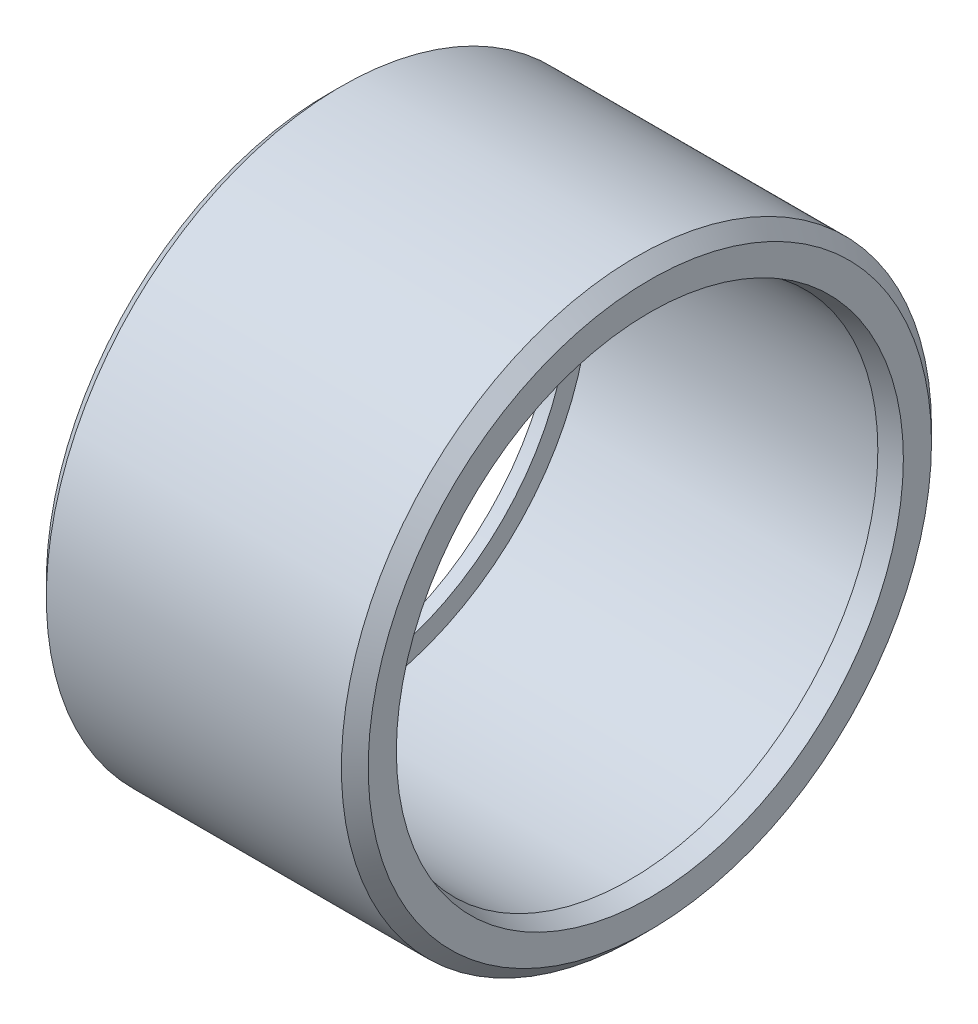
ISO-10303-21;
HEADER;
FILE_DESCRIPTION(('STEP AP214'),'2;1');
FILE_NAME('part.step','',(''),(''),'','','');
FILE_SCHEMA(('AUTOMOTIVE_DESIGN { 1 0 10303 214 1 1 1 1 }'));
ENDSEC;
DATA;
#1=APPLICATION_CONTEXT('core data for automotive mechanical design processes');
#2=APPLICATION_PROTOCOL_DEFINITION('international standard','automotive_design',2000,#1);
#3=PRODUCT_CONTEXT('',#1,'mechanical');
#4=PRODUCT('Part','Part','',(#3));
#5=PRODUCT_RELATED_PRODUCT_CATEGORY('part','',(#4));
#6=PRODUCT_DEFINITION_FORMATION('','',#4);
#7=PRODUCT_DEFINITION_CONTEXT('part definition',#1,'design');
#8=PRODUCT_DEFINITION('design','',#6,#7);
#9=PRODUCT_DEFINITION_SHAPE('','',#8);
#10=(LENGTH_UNIT() NAMED_UNIT(*) SI_UNIT(.MILLI.,.METRE.));
#11=(NAMED_UNIT(*) PLANE_ANGLE_UNIT() SI_UNIT($,.RADIAN.));
#12=(NAMED_UNIT(*) SI_UNIT($,.STERADIAN.) SOLID_ANGLE_UNIT());
#13=UNCERTAINTY_MEASURE_WITH_UNIT(LENGTH_MEASURE(1.E-05),#10,'distance_accuracy_value','');
#14=(GEOMETRIC_REPRESENTATION_CONTEXT(3) GLOBAL_UNCERTAINTY_ASSIGNED_CONTEXT((#13)) GLOBAL_UNIT_ASSIGNED_CONTEXT((#10,
#11,#12)) REPRESENTATION_CONTEXT('',''));
#15=CARTESIAN_POINT('',(0.,0.,0.));
#16=DIRECTION('',(0.,0.,1.));
#17=DIRECTION('',(1.,0.,0.));
#18=AXIS2_PLACEMENT_3D('',#15,#16,#17);
#19=CARTESIAN_POINT('',(0.,0.,0.));
#20=DIRECTION('',(1.,0.,0.));
#21=DIRECTION('',(0.,0.,-1.));
#22=AXIS2_PLACEMENT_3D('',#19,#20,#21);
#23=CYLINDRICAL_SURFACE('',#22,17.);
#24=CARTESIAN_POINT('',(-21.,0.,0.));
#25=DIRECTION('',(1.,0.,0.));
#26=DIRECTION('',(0.,0.,-1.));
#27=AXIS2_PLACEMENT_3D('',#24,#25,#26);
#28=CIRCLE('',#27,17.);
#29=CARTESIAN_POINT('',(-21.,0.,-17.));
#30=VERTEX_POINT('',#29);
#31=EDGE_CURVE('E62',#30,#30,#28,.T.);
#32=ORIENTED_EDGE('',*,*,#31,.T.);
#33=EDGE_LOOP('',(#32));
#34=FACE_BOUND('',#33,.T.);
#35=CARTESIAN_POINT('',(-22.,0.,0.));
#36=DIRECTION('',(1.,0.,0.));
#37=DIRECTION('',(0.,0.,-1.));
#38=AXIS2_PLACEMENT_3D('',#35,#36,#37);
#39=CIRCLE('',#38,17.);
#40=CARTESIAN_POINT('',(-22.,0.,-17.));
#41=VERTEX_POINT('',#40);
#42=EDGE_CURVE('E10',#41,#41,#39,.T.);
#43=ORIENTED_EDGE('',*,*,#42,.F.);
#44=EDGE_LOOP('',(#43));
#45=FACE_BOUND('',#44,.T.);
#46=ADVANCED_FACE('F31',(#34,#45),#23,.F.);
#47=CARTESIAN_POINT('',(-22.,17.,0.));
#48=DIRECTION('',(-1.,0.,0.));
#49=DIRECTION('',(0.,0.,1.));
#50=AXIS2_PLACEMENT_3D('',#47,#48,#49);
#51=PLANE('',#50);
#52=ORIENTED_EDGE('',*,*,#42,.T.);
#53=EDGE_LOOP('',(#52));
#54=FACE_BOUND('',#53,.T.);
#55=CARTESIAN_POINT('',(-22.,0.,0.));
#56=DIRECTION('',(1.,0.,0.));
#57=DIRECTION('',(0.,0.,-1.));
#58=AXIS2_PLACEMENT_3D('',#55,#56,#57);
#59=CIRCLE('',#58,21.);
#60=CARTESIAN_POINT('',(-22.,0.,-21.));
#61=VERTEX_POINT('',#60);
#62=EDGE_CURVE('E37',#61,#61,#59,.T.);
#63=ORIENTED_EDGE('',*,*,#62,.F.);
#64=EDGE_LOOP('',(#63));
#65=FACE_BOUND('',#64,.T.);
#66=ADVANCED_FACE('F80',(#54,#65),#51,.T.);
#67=CARTESIAN_POINT('',(-21.,0.,0.));
#68=DIRECTION('',(1.,0.,0.));
#69=DIRECTION('',(0.,0.,-1.));
#70=AXIS2_PLACEMENT_3D('',#67,#68,#69);
#71=CONICAL_SURFACE('',#70,22.,0.785398163397448);
#72=ORIENTED_EDGE('',*,*,#62,.T.);
#73=EDGE_LOOP('',(#72));
#74=FACE_BOUND('',#73,.T.);
#75=CARTESIAN_POINT('',(-21.,0.,0.));
#76=DIRECTION('',(1.,0.,0.));
#77=DIRECTION('',(0.,0.,-1.));
#78=AXIS2_PLACEMENT_3D('',#75,#76,#77);
#79=CIRCLE('',#78,22.);
#80=CARTESIAN_POINT('',(-21.,0.,-22.));
#81=VERTEX_POINT('',#80);
#82=EDGE_CURVE('E41',#81,#81,#79,.T.);
#83=ORIENTED_EDGE('',*,*,#82,.F.);
#84=EDGE_LOOP('',(#83));
#85=FACE_BOUND('',#84,.T.);
#86=ADVANCED_FACE('F84',(#74,#85),#71,.T.);
#87=CARTESIAN_POINT('',(0.,0.,0.));
#88=DIRECTION('',(1.,0.,0.));
#89=DIRECTION('',(0.,0.,-1.));
#90=AXIS2_PLACEMENT_3D('',#87,#88,#89);
#91=CYLINDRICAL_SURFACE('',#90,22.);
#92=ORIENTED_EDGE('',*,*,#82,.T.);
#93=EDGE_LOOP('',(#92));
#94=FACE_BOUND('',#93,.T.);
#95=CARTESIAN_POINT('',(0.999999999999998,0.,0.));
#96=DIRECTION('',(1.,0.,0.));
#97=DIRECTION('',(0.,0.,-1.));
#98=AXIS2_PLACEMENT_3D('',#95,#96,#97);
#99=CIRCLE('',#98,22.);
#100=CARTESIAN_POINT('',(0.999999999999998,0.,-22.));
#101=VERTEX_POINT('',#100);
#102=EDGE_CURVE('E45',#101,#101,#99,.T.);
#103=ORIENTED_EDGE('',*,*,#102,.F.);
#104=EDGE_LOOP('',(#103));
#105=FACE_BOUND('',#104,.T.);
#106=ADVANCED_FACE('F88',(#94,#105),#91,.T.);
#107=CARTESIAN_POINT('',(2.,0.,0.));
#108=DIRECTION('',(-1.,0.,0.));
#109=DIRECTION('',(0.,0.,1.));
#110=AXIS2_PLACEMENT_3D('',#107,#108,#109);
#111=CONICAL_SURFACE('',#110,21.,0.785398163397449);
#112=ORIENTED_EDGE('',*,*,#102,.T.);
#113=EDGE_LOOP('',(#112));
#114=FACE_BOUND('',#113,.T.);
#115=CARTESIAN_POINT('',(2.,0.,0.));
#116=DIRECTION('',(1.,0.,0.));
#117=DIRECTION('',(0.,0.,-1.));
#118=AXIS2_PLACEMENT_3D('',#115,#116,#117);
#119=CIRCLE('',#118,21.);
#120=CARTESIAN_POINT('',(2.,0.,-21.));
#121=VERTEX_POINT('',#120);
#122=EDGE_CURVE('E50',#121,#121,#119,.T.);
#123=ORIENTED_EDGE('',*,*,#122,.F.);
#124=EDGE_LOOP('',(#123));
#125=FACE_BOUND('',#124,.T.);
#126=ADVANCED_FACE('F94',(#114,#125),#111,.T.);
#127=CARTESIAN_POINT('',(2.,21.,0.));
#128=DIRECTION('',(1.,0.,0.));
#129=DIRECTION('',(0.,0.,-1.));
#130=AXIS2_PLACEMENT_3D('',#127,#128,#129);
#131=PLANE('',#130);
#132=ORIENTED_EDGE('',*,*,#122,.T.);
#133=EDGE_LOOP('',(#132));
#134=FACE_BOUND('',#133,.T.);
#135=CARTESIAN_POINT('',(2.,0.,0.));
#136=DIRECTION('',(1.,0.,0.));
#137=DIRECTION('',(0.,0.,-1.));
#138=AXIS2_PLACEMENT_3D('',#135,#136,#137);
#139=CIRCLE('',#138,18.9019237886467);
#140=CARTESIAN_POINT('',(2.,0.,-18.9019237886467));
#141=VERTEX_POINT('',#140);
#142=EDGE_CURVE('E53',#141,#141,#139,.T.);
#143=ORIENTED_EDGE('',*,*,#142,.F.);
#144=EDGE_LOOP('',(#143));
#145=FACE_BOUND('',#144,.T.);
#146=ADVANCED_FACE('F98',(#134,#145),#131,.T.);
#147=CARTESIAN_POINT('',(0.5,0.,0.));
#148=DIRECTION('',(1.,0.,0.));
#149=DIRECTION('',(0.,0.,-1.));
#150=AXIS2_PLACEMENT_3D('',#147,#148,#149);
#151=CONICAL_SURFACE('',#150,18.5,0.261799387799143);
#152=ORIENTED_EDGE('',*,*,#142,.T.);
#153=EDGE_LOOP('',(#152));
#154=FACE_BOUND('',#153,.T.);
#155=CARTESIAN_POINT('',(0.5,0.,0.));
#156=DIRECTION('',(1.,0.,0.));
#157=DIRECTION('',(0.,0.,-1.));
#158=AXIS2_PLACEMENT_3D('',#155,#156,#157);
#159=CIRCLE('',#158,18.5);
#160=CARTESIAN_POINT('',(0.5,0.,-18.5));
#161=VERTEX_POINT('',#160);
#162=EDGE_CURVE('E56',#161,#161,#159,.T.);
#163=ORIENTED_EDGE('',*,*,#162,.F.);
#164=EDGE_LOOP('',(#163));
#165=FACE_BOUND('',#164,.T.);
#166=ADVANCED_FACE('F76',(#154,#165),#151,.F.);
#167=CARTESIAN_POINT('',(0.,0.,0.));
#168=DIRECTION('',(1.,0.,0.));
#169=DIRECTION('',(0.,0.,-1.));
#170=AXIS2_PLACEMENT_3D('',#167,#168,#169);
#171=CYLINDRICAL_SURFACE('',#170,18.5);
#172=ORIENTED_EDGE('',*,*,#162,.T.);
#173=EDGE_LOOP('',(#172));
#174=FACE_BOUND('',#173,.T.);
#175=CARTESIAN_POINT('',(-21.,0.,0.));
#176=DIRECTION('',(1.,0.,0.));
#177=DIRECTION('',(0.,0.,-1.));
#178=AXIS2_PLACEMENT_3D('',#175,#176,#177);
#179=CIRCLE('',#178,18.5);
#180=CARTESIAN_POINT('',(-21.,0.,-18.5));
#181=VERTEX_POINT('',#180);
#182=EDGE_CURVE('E59',#181,#181,#179,.T.);
#183=ORIENTED_EDGE('',*,*,#182,.F.);
#184=EDGE_LOOP('',(#183));
#185=FACE_BOUND('',#184,.T.);
#186=ADVANCED_FACE('F70',(#174,#185),#171,.F.);
#187=CARTESIAN_POINT('',(-21.,18.5,0.));
#188=DIRECTION('',(1.,0.,0.));
#189=DIRECTION('',(0.,0.,-1.));
#190=AXIS2_PLACEMENT_3D('',#187,#188,#189);
#191=PLANE('',#190);
#192=ORIENTED_EDGE('',*,*,#182,.T.);
#193=EDGE_LOOP('',(#192));
#194=FACE_BOUND('',#193,.T.);
#195=ORIENTED_EDGE('',*,*,#31,.F.);
#196=EDGE_LOOP('',(#195));
#197=FACE_BOUND('',#196,.T.);
#198=ADVANCED_FACE('F68',(#194,#197),#191,.T.);
#199=CLOSED_SHELL('',(#46,#66,#86,#106,#126,#146,#166,#186,#198));
#200=MANIFOLD_SOLID_BREP('B2',#199);
#201=ADVANCED_BREP_SHAPE_REPRESENTATION('',(#18,#200),#14);
#202=SHAPE_DEFINITION_REPRESENTATION(#9,#201);
ENDSEC;
END-ISO-10303-21;
